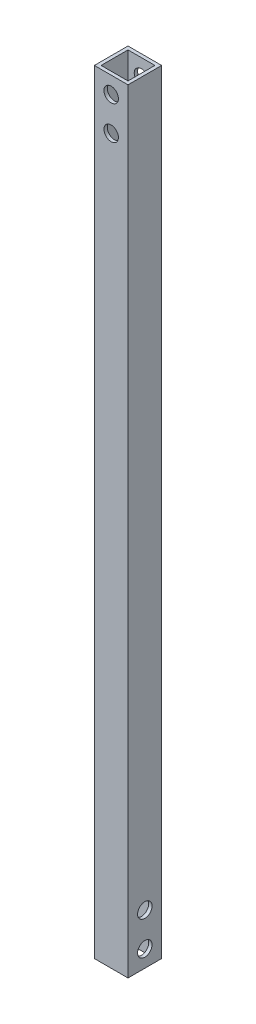
ISO-10303-21;
HEADER;
FILE_DESCRIPTION(('STEP AP214'),'2;1');
FILE_NAME('part.step','',(''),(''),'','','');
FILE_SCHEMA(('AUTOMOTIVE_DESIGN { 1 0 10303 214 1 1 1 1 }'));
ENDSEC;
DATA;
#1=APPLICATION_CONTEXT('core data for automotive mechanical design processes');
#2=APPLICATION_PROTOCOL_DEFINITION('international standard','automotive_design',2000,#1);
#3=PRODUCT_CONTEXT('',#1,'mechanical');
#4=PRODUCT('Part','Part','',(#3));
#5=PRODUCT_RELATED_PRODUCT_CATEGORY('part','',(#4));
#6=PRODUCT_DEFINITION_FORMATION('','',#4);
#7=PRODUCT_DEFINITION_CONTEXT('part definition',#1,'design');
#8=PRODUCT_DEFINITION('design','',#6,#7);
#9=PRODUCT_DEFINITION_SHAPE('','',#8);
#10=(LENGTH_UNIT() NAMED_UNIT(*) SI_UNIT(.MILLI.,.METRE.));
#11=(NAMED_UNIT(*) PLANE_ANGLE_UNIT() SI_UNIT($,.RADIAN.));
#12=(NAMED_UNIT(*) SI_UNIT($,.STERADIAN.) SOLID_ANGLE_UNIT());
#13=UNCERTAINTY_MEASURE_WITH_UNIT(LENGTH_MEASURE(1.E-05),#10,'distance_accuracy_value','');
#14=(GEOMETRIC_REPRESENTATION_CONTEXT(3) GLOBAL_UNCERTAINTY_ASSIGNED_CONTEXT((#13)) GLOBAL_UNIT_ASSIGNED_CONTEXT((#10,
#11,#12)) REPRESENTATION_CONTEXT('',''));
#15=CARTESIAN_POINT('',(0.,0.,0.));
#16=DIRECTION('',(0.,0.,1.));
#17=DIRECTION('',(1.,0.,0.));
#18=AXIS2_PLACEMENT_3D('',#15,#16,#17);
#19=CARTESIAN_POINT('',(0.,230.,0.));
#20=DIRECTION('',(0.,1.,0.));
#21=DIRECTION('',(0.,0.,1.));
#22=AXIS2_PLACEMENT_3D('',#19,#20,#21);
#23=PLANE('',#22);
#24=DIRECTION('',(0.,0.,-1.));
#25=VECTOR('',#24,1.);
#26=CARTESIAN_POINT('',(5.,230.,-5.));
#27=LINE('',#26,#25);
#28=CARTESIAN_POINT('',(5.,230.,5.));
#29=VERTEX_POINT('',#28);
#30=CARTESIAN_POINT('',(5.,230.,-5.));
#31=VERTEX_POINT('',#30);
#32=EDGE_CURVE('E164',#29,#31,#27,.T.);
#33=ORIENTED_EDGE('',*,*,#32,.T.);
#34=DIRECTION('',(-1.,0.,0.));
#35=VECTOR('',#34,1.);
#36=CARTESIAN_POINT('',(-5.,230.,-5.));
#37=LINE('',#36,#35);
#38=CARTESIAN_POINT('',(-5.,230.,-5.));
#39=VERTEX_POINT('',#38);
#40=EDGE_CURVE('E167',#31,#39,#37,.T.);
#41=ORIENTED_EDGE('',*,*,#40,.T.);
#42=DIRECTION('',(0.,0.,1.));
#43=VECTOR('',#42,1.);
#44=CARTESIAN_POINT('',(-5.,230.,-5.));
#45=LINE('',#44,#43);
#46=CARTESIAN_POINT('',(-5.,230.,5.));
#47=VERTEX_POINT('',#46);
#48=EDGE_CURVE('E170',#39,#47,#45,.T.);
#49=ORIENTED_EDGE('',*,*,#48,.T.);
#50=DIRECTION('',(1.,0.,0.));
#51=VECTOR('',#50,1.);
#52=CARTESIAN_POINT('',(-5.,230.,5.));
#53=LINE('',#52,#51);
#54=EDGE_CURVE('E172',#47,#29,#53,.T.);
#55=ORIENTED_EDGE('',*,*,#54,.T.);
#56=EDGE_LOOP('',(#33,#41,#49,#55));
#57=FACE_BOUND('',#56,.T.);
#58=DIRECTION('',(-1.,0.,0.));
#59=VECTOR('',#58,1.);
#60=CARTESIAN_POINT('',(-5.,230.,-4.));
#61=LINE('',#60,#59);
#62=CARTESIAN_POINT('',(4.,230.,-4.));
#63=VERTEX_POINT('',#62);
#64=CARTESIAN_POINT('',(-4.,230.,-4.));
#65=VERTEX_POINT('',#64);
#66=EDGE_CURVE('E134',#63,#65,#61,.T.);
#67=ORIENTED_EDGE('',*,*,#66,.F.);
#68=DIRECTION('',(0.,0.,-1.));
#69=VECTOR('',#68,1.);
#70=CARTESIAN_POINT('',(4.,230.,-5.));
#71=LINE('',#70,#69);
#72=CARTESIAN_POINT('',(4.,230.,4.));
#73=VERTEX_POINT('',#72);
#74=EDGE_CURVE('E126',#73,#63,#71,.T.);
#75=ORIENTED_EDGE('',*,*,#74,.F.);
#76=DIRECTION('',(1.,0.,0.));
#77=VECTOR('',#76,1.);
#78=CARTESIAN_POINT('',(-5.,230.,4.));
#79=LINE('',#78,#77);
#80=CARTESIAN_POINT('',(-4.,230.,4.));
#81=VERTEX_POINT('',#80);
#82=EDGE_CURVE('E148',#81,#73,#79,.T.);
#83=ORIENTED_EDGE('',*,*,#82,.F.);
#84=DIRECTION('',(0.,0.,1.));
#85=VECTOR('',#84,1.);
#86=CARTESIAN_POINT('',(-4.,230.,-5.));
#87=LINE('',#86,#85);
#88=EDGE_CURVE('E146',#65,#81,#87,.T.);
#89=ORIENTED_EDGE('',*,*,#88,.F.);
#90=EDGE_LOOP('',(#67,#75,#83,#89));
#91=FACE_BOUND('',#90,.T.);
#92=ADVANCED_FACE('F59',(#57,#91),#23,.T.);
#93=CARTESIAN_POINT('',(0.,0.,0.));
#94=DIRECTION('',(0.,1.,0.));
#95=DIRECTION('',(0.,0.,1.));
#96=AXIS2_PLACEMENT_3D('',#93,#94,#95);
#97=PLANE('',#96);
#98=DIRECTION('',(0.,0.,-1.));
#99=VECTOR('',#98,1.);
#100=CARTESIAN_POINT('',(5.,0.,-5.));
#101=LINE('',#100,#99);
#102=CARTESIAN_POINT('',(5.,0.,5.));
#103=VERTEX_POINT('',#102);
#104=CARTESIAN_POINT('',(5.,0.,-5.));
#105=VERTEX_POINT('',#104);
#106=EDGE_CURVE('E142',#103,#105,#101,.T.);
#107=ORIENTED_EDGE('',*,*,#106,.F.);
#108=DIRECTION('',(1.,0.,0.));
#109=VECTOR('',#108,1.);
#110=CARTESIAN_POINT('',(-5.,0.,5.));
#111=LINE('',#110,#109);
#112=CARTESIAN_POINT('',(-5.,0.,5.));
#113=VERTEX_POINT('',#112);
#114=EDGE_CURVE('E168',#113,#103,#111,.T.);
#115=ORIENTED_EDGE('',*,*,#114,.F.);
#116=DIRECTION('',(0.,0.,1.));
#117=VECTOR('',#116,1.);
#118=CARTESIAN_POINT('',(-5.,0.,-5.));
#119=LINE('',#118,#117);
#120=CARTESIAN_POINT('',(-5.,0.,-5.));
#121=VERTEX_POINT('',#120);
#122=EDGE_CURVE('E179',#121,#113,#119,.T.);
#123=ORIENTED_EDGE('',*,*,#122,.F.);
#124=DIRECTION('',(-1.,0.,0.));
#125=VECTOR('',#124,1.);
#126=CARTESIAN_POINT('',(-5.,0.,-5.));
#127=LINE('',#126,#125);
#128=EDGE_CURVE('E177',#105,#121,#127,.T.);
#129=ORIENTED_EDGE('',*,*,#128,.F.);
#130=EDGE_LOOP('',(#107,#115,#123,#129));
#131=FACE_BOUND('',#130,.T.);
#132=DIRECTION('',(0.,0.,-1.));
#133=VECTOR('',#132,1.);
#134=CARTESIAN_POINT('',(4.,0.,-5.));
#135=LINE('',#134,#133);
#136=CARTESIAN_POINT('',(4.,0.,4.));
#137=VERTEX_POINT('',#136);
#138=CARTESIAN_POINT('',(4.,0.,-4.));
#139=VERTEX_POINT('',#138);
#140=EDGE_CURVE('E84',#137,#139,#135,.T.);
#141=ORIENTED_EDGE('',*,*,#140,.T.);
#142=DIRECTION('',(-1.,0.,0.));
#143=VECTOR('',#142,1.);
#144=CARTESIAN_POINT('',(-5.,0.,-4.));
#145=LINE('',#144,#143);
#146=CARTESIAN_POINT('',(-4.,0.,-4.));
#147=VERTEX_POINT('',#146);
#148=EDGE_CURVE('E141',#139,#147,#145,.T.);
#149=ORIENTED_EDGE('',*,*,#148,.T.);
#150=DIRECTION('',(0.,0.,1.));
#151=VECTOR('',#150,1.);
#152=CARTESIAN_POINT('',(-4.,0.,-5.));
#153=LINE('',#152,#151);
#154=CARTESIAN_POINT('',(-4.,0.,4.));
#155=VERTEX_POINT('',#154);
#156=EDGE_CURVE('E156',#147,#155,#153,.T.);
#157=ORIENTED_EDGE('',*,*,#156,.T.);
#158=DIRECTION('',(1.,0.,0.));
#159=VECTOR('',#158,1.);
#160=CARTESIAN_POINT('',(-5.,0.,4.));
#161=LINE('',#160,#159);
#162=EDGE_CURVE('E135',#155,#137,#161,.T.);
#163=ORIENTED_EDGE('',*,*,#162,.T.);
#164=EDGE_LOOP('',(#141,#149,#157,#163));
#165=FACE_BOUND('',#164,.T.);
#166=ADVANCED_FACE('F262',(#131,#165),#97,.F.);
#167=CARTESIAN_POINT('',(5.,230.,-5.));
#168=DIRECTION('',(-1.,0.,0.));
#169=DIRECTION('',(0.,0.,1.));
#170=AXIS2_PLACEMENT_3D('',#167,#168,#169);
#171=PLANE('',#170);
#172=CARTESIAN_POINT('',(5.,15.,0.));
#173=DIRECTION('',(1.,0.,0.));
#174=DIRECTION('',(0.,0.,-1.));
#175=AXIS2_PLACEMENT_3D('',#172,#173,#174);
#176=CIRCLE('',#175,2.15);
#177=CARTESIAN_POINT('',(5.,15.,-2.15));
#178=VERTEX_POINT('',#177);
#179=EDGE_CURVE('E205',#178,#178,#176,.T.);
#180=ORIENTED_EDGE('',*,*,#179,.F.);
#181=EDGE_LOOP('',(#180));
#182=FACE_BOUND('',#181,.T.);
#183=CARTESIAN_POINT('',(5.,5.,0.));
#184=DIRECTION('',(1.,0.,0.));
#185=DIRECTION('',(0.,0.,-1.));
#186=AXIS2_PLACEMENT_3D('',#183,#184,#185);
#187=CIRCLE('',#186,2.15);
#188=CARTESIAN_POINT('',(5.,5.,-2.15));
#189=VERTEX_POINT('',#188);
#190=EDGE_CURVE('E215',#189,#189,#187,.T.);
#191=ORIENTED_EDGE('',*,*,#190,.F.);
#192=EDGE_LOOP('',(#191));
#193=FACE_BOUND('',#192,.T.);
#194=ORIENTED_EDGE('',*,*,#106,.T.);
#195=DIRECTION('',(0.,-1.,0.));
#196=VECTOR('',#195,1.);
#197=CARTESIAN_POINT('',(5.,230.,-5.));
#198=LINE('',#197,#196);
#199=EDGE_CURVE('E12',#31,#105,#198,.T.);
#200=ORIENTED_EDGE('',*,*,#199,.F.);
#201=ORIENTED_EDGE('',*,*,#32,.F.);
#202=DIRECTION('',(0.,-1.,0.));
#203=VECTOR('',#202,1.);
#204=CARTESIAN_POINT('',(5.,230.,5.));
#205=LINE('',#204,#203);
#206=EDGE_CURVE('E174',#29,#103,#205,.T.);
#207=ORIENTED_EDGE('',*,*,#206,.T.);
#208=EDGE_LOOP('',(#194,#200,#201,#207));
#209=FACE_BOUND('',#208,.T.);
#210=ADVANCED_FACE('F61',(#182,#193,#209),#171,.F.);
#211=CARTESIAN_POINT('',(-5.,230.,-5.));
#212=DIRECTION('',(0.,0.,1.));
#213=DIRECTION('',(1.,0.,0.));
#214=AXIS2_PLACEMENT_3D('',#211,#212,#213);
#215=PLANE('',#214);
#216=CARTESIAN_POINT('',(0.,215.,-5.));
#217=DIRECTION('',(0.,0.,-1.));
#218=DIRECTION('',(-1.,0.,0.));
#219=AXIS2_PLACEMENT_3D('',#216,#217,#218);
#220=CIRCLE('',#219,2.15000000000002);
#221=CARTESIAN_POINT('',(-2.15000000000002,215.,-5.));
#222=VERTEX_POINT('',#221);
#223=EDGE_CURVE('E193',#222,#222,#220,.T.);
#224=ORIENTED_EDGE('',*,*,#223,.F.);
#225=EDGE_LOOP('',(#224));
#226=FACE_BOUND('',#225,.T.);
#227=CARTESIAN_POINT('',(0.,225.,-5.));
#228=DIRECTION('',(0.,0.,-1.));
#229=DIRECTION('',(-1.,0.,0.));
#230=AXIS2_PLACEMENT_3D('',#227,#228,#229);
#231=CIRCLE('',#230,2.15000000000002);
#232=CARTESIAN_POINT('',(-2.15000000000002,225.,-5.));
#233=VERTEX_POINT('',#232);
#234=EDGE_CURVE('E227',#233,#233,#231,.T.);
#235=ORIENTED_EDGE('',*,*,#234,.F.);
#236=EDGE_LOOP('',(#235));
#237=FACE_BOUND('',#236,.T.);
#238=ORIENTED_EDGE('',*,*,#128,.T.);
#239=DIRECTION('',(0.,-1.,0.));
#240=VECTOR('',#239,1.);
#241=CARTESIAN_POINT('',(-5.,230.,-5.));
#242=LINE('',#241,#240);
#243=EDGE_CURVE('E68',#39,#121,#242,.T.);
#244=ORIENTED_EDGE('',*,*,#243,.F.);
#245=ORIENTED_EDGE('',*,*,#40,.F.);
#246=ORIENTED_EDGE('',*,*,#199,.T.);
#247=EDGE_LOOP('',(#238,#244,#245,#246));
#248=FACE_BOUND('',#247,.T.);
#249=ADVANCED_FACE('F247',(#226,#237,#248),#215,.F.);
#250=CARTESIAN_POINT('',(-5.,230.,-5.));
#251=DIRECTION('',(1.,0.,0.));
#252=DIRECTION('',(0.,0.,-1.));
#253=AXIS2_PLACEMENT_3D('',#250,#251,#252);
#254=PLANE('',#253);
#255=CARTESIAN_POINT('',(-5.,15.,0.));
#256=DIRECTION('',(1.,0.,0.));
#257=DIRECTION('',(0.,0.,-1.));
#258=AXIS2_PLACEMENT_3D('',#255,#256,#257);
#259=CIRCLE('',#258,2.15);
#260=CARTESIAN_POINT('',(-5.,15.,-2.15));
#261=VERTEX_POINT('',#260);
#262=EDGE_CURVE('E199',#261,#261,#259,.T.);
#263=ORIENTED_EDGE('',*,*,#262,.T.);
#264=EDGE_LOOP('',(#263));
#265=FACE_BOUND('',#264,.T.);
#266=CARTESIAN_POINT('',(-5.,5.,0.));
#267=DIRECTION('',(1.,0.,0.));
#268=DIRECTION('',(0.,0.,-1.));
#269=AXIS2_PLACEMENT_3D('',#266,#267,#268);
#270=CIRCLE('',#269,2.15);
#271=CARTESIAN_POINT('',(-5.,5.,-2.15));
#272=VERTEX_POINT('',#271);
#273=EDGE_CURVE('E210',#272,#272,#270,.T.);
#274=ORIENTED_EDGE('',*,*,#273,.T.);
#275=EDGE_LOOP('',(#274));
#276=FACE_BOUND('',#275,.T.);
#277=ORIENTED_EDGE('',*,*,#122,.T.);
#278=DIRECTION('',(0.,-1.,0.));
#279=VECTOR('',#278,1.);
#280=CARTESIAN_POINT('',(-5.,230.,5.));
#281=LINE('',#280,#279);
#282=EDGE_CURVE('E184',#47,#113,#281,.T.);
#283=ORIENTED_EDGE('',*,*,#282,.F.);
#284=ORIENTED_EDGE('',*,*,#48,.F.);
#285=ORIENTED_EDGE('',*,*,#243,.T.);
#286=EDGE_LOOP('',(#277,#283,#284,#285));
#287=FACE_BOUND('',#286,.T.);
#288=ADVANCED_FACE('F250',(#265,#276,#287),#254,.F.);
#289=CARTESIAN_POINT('',(-5.,230.,5.));
#290=DIRECTION('',(0.,0.,-1.));
#291=DIRECTION('',(-1.,0.,0.));
#292=AXIS2_PLACEMENT_3D('',#289,#290,#291);
#293=PLANE('',#292);
#294=CARTESIAN_POINT('',(0.,215.,5.));
#295=DIRECTION('',(0.,0.,-1.));
#296=DIRECTION('',(-1.,0.,0.));
#297=AXIS2_PLACEMENT_3D('',#294,#295,#296);
#298=CIRCLE('',#297,2.15000000000002);
#299=CARTESIAN_POINT('',(-2.15000000000002,215.,5.));
#300=VERTEX_POINT('',#299);
#301=EDGE_CURVE('E224',#300,#300,#298,.T.);
#302=ORIENTED_EDGE('',*,*,#301,.T.);
#303=EDGE_LOOP('',(#302));
#304=FACE_BOUND('',#303,.T.);
#305=CARTESIAN_POINT('',(0.,225.,5.));
#306=DIRECTION('',(0.,0.,-1.));
#307=DIRECTION('',(-1.,0.,0.));
#308=AXIS2_PLACEMENT_3D('',#305,#306,#307);
#309=CIRCLE('',#308,2.15000000000002);
#310=CARTESIAN_POINT('',(-2.15000000000002,225.,5.));
#311=VERTEX_POINT('',#310);
#312=EDGE_CURVE('E221',#311,#311,#309,.T.);
#313=ORIENTED_EDGE('',*,*,#312,.T.);
#314=EDGE_LOOP('',(#313));
#315=FACE_BOUND('',#314,.T.);
#316=ORIENTED_EDGE('',*,*,#114,.T.);
#317=ORIENTED_EDGE('',*,*,#206,.F.);
#318=ORIENTED_EDGE('',*,*,#54,.F.);
#319=ORIENTED_EDGE('',*,*,#282,.T.);
#320=EDGE_LOOP('',(#316,#317,#318,#319));
#321=FACE_BOUND('',#320,.T.);
#322=ADVANCED_FACE('F266',(#304,#315,#321),#293,.F.);
#323=CARTESIAN_POINT('',(4.,230.,-5.));
#324=DIRECTION('',(-1.,0.,0.));
#325=DIRECTION('',(0.,0.,1.));
#326=AXIS2_PLACEMENT_3D('',#323,#324,#325);
#327=PLANE('',#326);
#328=CARTESIAN_POINT('',(4.,15.,0.));
#329=DIRECTION('',(-1.,0.,0.));
#330=DIRECTION('',(0.,0.,1.));
#331=AXIS2_PLACEMENT_3D('',#328,#329,#330);
#332=CIRCLE('',#331,2.15);
#333=CARTESIAN_POINT('',(4.,15.,-2.15));
#334=VERTEX_POINT('',#333);
#335=EDGE_CURVE('E218',#334,#334,#332,.T.);
#336=ORIENTED_EDGE('',*,*,#335,.F.);
#337=EDGE_LOOP('',(#336));
#338=FACE_BOUND('',#337,.T.);
#339=CARTESIAN_POINT('',(4.,5.,0.));
#340=DIRECTION('',(-1.,0.,0.));
#341=DIRECTION('',(0.,0.,1.));
#342=AXIS2_PLACEMENT_3D('',#339,#340,#341);
#343=CIRCLE('',#342,2.15);
#344=CARTESIAN_POINT('',(4.,5.,-2.15));
#345=VERTEX_POINT('',#344);
#346=EDGE_CURVE('E198',#345,#345,#343,.T.);
#347=ORIENTED_EDGE('',*,*,#346,.F.);
#348=EDGE_LOOP('',(#347));
#349=FACE_BOUND('',#348,.T.);
#350=ORIENTED_EDGE('',*,*,#140,.F.);
#351=DIRECTION('',(0.,-1.,0.));
#352=VECTOR('',#351,1.);
#353=CARTESIAN_POINT('',(4.,230.,4.));
#354=LINE('',#353,#352);
#355=EDGE_CURVE('E130',#73,#137,#354,.T.);
#356=ORIENTED_EDGE('',*,*,#355,.F.);
#357=ORIENTED_EDGE('',*,*,#74,.T.);
#358=DIRECTION('',(0.,-1.,0.));
#359=VECTOR('',#358,1.);
#360=CARTESIAN_POINT('',(4.,230.,-4.));
#361=LINE('',#360,#359);
#362=EDGE_CURVE('E129',#63,#139,#361,.T.);
#363=ORIENTED_EDGE('',*,*,#362,.T.);
#364=EDGE_LOOP('',(#350,#356,#357,#363));
#365=FACE_BOUND('',#364,.T.);
#366=ADVANCED_FACE('F128',(#338,#349,#365),#327,.T.);
#367=CARTESIAN_POINT('',(-5.,230.,-4.));
#368=DIRECTION('',(0.,0.,1.));
#369=DIRECTION('',(1.,0.,0.));
#370=AXIS2_PLACEMENT_3D('',#367,#368,#369);
#371=PLANE('',#370);
#372=CARTESIAN_POINT('',(0.,215.,-4.));
#373=DIRECTION('',(0.,0.,1.));
#374=DIRECTION('',(1.,0.,0.));
#375=AXIS2_PLACEMENT_3D('',#372,#373,#374);
#376=CIRCLE('',#375,2.15000000000002);
#377=CARTESIAN_POINT('',(2.15000000000002,215.,-4.));
#378=VERTEX_POINT('',#377);
#379=EDGE_CURVE('E154',#378,#378,#376,.F.);
#380=ORIENTED_EDGE('',*,*,#379,.T.);
#381=EDGE_LOOP('',(#380));
#382=FACE_BOUND('',#381,.T.);
#383=CARTESIAN_POINT('',(0.,225.,-4.));
#384=DIRECTION('',(0.,0.,1.));
#385=DIRECTION('',(1.,0.,0.));
#386=AXIS2_PLACEMENT_3D('',#383,#384,#385);
#387=CIRCLE('',#386,2.15000000000002);
#388=CARTESIAN_POINT('',(2.15000000000002,225.,-4.));
#389=VERTEX_POINT('',#388);
#390=EDGE_CURVE('E192',#389,#389,#387,.F.);
#391=ORIENTED_EDGE('',*,*,#390,.T.);
#392=EDGE_LOOP('',(#391));
#393=FACE_BOUND('',#392,.T.);
#394=ORIENTED_EDGE('',*,*,#148,.F.);
#395=ORIENTED_EDGE('',*,*,#362,.F.);
#396=ORIENTED_EDGE('',*,*,#66,.T.);
#397=DIRECTION('',(0.,-1.,0.));
#398=VECTOR('',#397,1.);
#399=CARTESIAN_POINT('',(-4.,230.,-4.));
#400=LINE('',#399,#398);
#401=EDGE_CURVE('E143',#65,#147,#400,.T.);
#402=ORIENTED_EDGE('',*,*,#401,.T.);
#403=EDGE_LOOP('',(#394,#395,#396,#402));
#404=FACE_BOUND('',#403,.T.);
#405=ADVANCED_FACE('F138',(#382,#393,#404),#371,.T.);
#406=CARTESIAN_POINT('',(-4.,230.,-5.));
#407=DIRECTION('',(1.,0.,0.));
#408=DIRECTION('',(0.,0.,-1.));
#409=AXIS2_PLACEMENT_3D('',#406,#407,#408);
#410=PLANE('',#409);
#411=CARTESIAN_POINT('',(-4.,15.,0.));
#412=DIRECTION('',(1.,0.,0.));
#413=DIRECTION('',(0.,0.,-1.));
#414=AXIS2_PLACEMENT_3D('',#411,#412,#413);
#415=CIRCLE('',#414,2.15);
#416=CARTESIAN_POINT('',(-4.,15.,-2.15));
#417=VERTEX_POINT('',#416);
#418=EDGE_CURVE('E63',#417,#417,#415,.T.);
#419=ORIENTED_EDGE('',*,*,#418,.F.);
#420=EDGE_LOOP('',(#419));
#421=FACE_BOUND('',#420,.T.);
#422=CARTESIAN_POINT('',(-4.,5.,0.));
#423=DIRECTION('',(1.,0.,0.));
#424=DIRECTION('',(0.,0.,-1.));
#425=AXIS2_PLACEMENT_3D('',#422,#423,#424);
#426=CIRCLE('',#425,2.15);
#427=CARTESIAN_POINT('',(-4.,5.,-2.15));
#428=VERTEX_POINT('',#427);
#429=EDGE_CURVE('E196',#428,#428,#426,.T.);
#430=ORIENTED_EDGE('',*,*,#429,.F.);
#431=EDGE_LOOP('',(#430));
#432=FACE_BOUND('',#431,.T.);
#433=ORIENTED_EDGE('',*,*,#156,.F.);
#434=ORIENTED_EDGE('',*,*,#401,.F.);
#435=ORIENTED_EDGE('',*,*,#88,.T.);
#436=DIRECTION('',(0.,-1.,0.));
#437=VECTOR('',#436,1.);
#438=CARTESIAN_POINT('',(-4.,230.,4.));
#439=LINE('',#438,#437);
#440=EDGE_CURVE('E76',#81,#155,#439,.T.);
#441=ORIENTED_EDGE('',*,*,#440,.T.);
#442=EDGE_LOOP('',(#433,#434,#435,#441));
#443=FACE_BOUND('',#442,.T.);
#444=ADVANCED_FACE('F342',(#421,#432,#443),#410,.T.);
#445=CARTESIAN_POINT('',(-5.,230.,4.));
#446=DIRECTION('',(0.,0.,-1.));
#447=DIRECTION('',(-1.,0.,0.));
#448=AXIS2_PLACEMENT_3D('',#445,#446,#447);
#449=PLANE('',#448);
#450=CARTESIAN_POINT('',(0.,215.,4.));
#451=DIRECTION('',(0.,0.,-1.));
#452=DIRECTION('',(-1.,0.,0.));
#453=AXIS2_PLACEMENT_3D('',#450,#451,#452);
#454=CIRCLE('',#453,2.15000000000002);
#455=CARTESIAN_POINT('',(-2.15000000000002,215.,4.));
#456=VERTEX_POINT('',#455);
#457=EDGE_CURVE('E194',#456,#456,#454,.F.);
#458=ORIENTED_EDGE('',*,*,#457,.T.);
#459=EDGE_LOOP('',(#458));
#460=FACE_BOUND('',#459,.T.);
#461=CARTESIAN_POINT('',(0.,225.,4.));
#462=DIRECTION('',(0.,0.,-1.));
#463=DIRECTION('',(-1.,0.,0.));
#464=AXIS2_PLACEMENT_3D('',#461,#462,#463);
#465=CIRCLE('',#464,2.15000000000002);
#466=CARTESIAN_POINT('',(-2.15000000000002,225.,4.));
#467=VERTEX_POINT('',#466);
#468=EDGE_CURVE('E189',#467,#467,#465,.F.);
#469=ORIENTED_EDGE('',*,*,#468,.T.);
#470=EDGE_LOOP('',(#469));
#471=FACE_BOUND('',#470,.T.);
#472=ORIENTED_EDGE('',*,*,#162,.F.);
#473=ORIENTED_EDGE('',*,*,#440,.F.);
#474=ORIENTED_EDGE('',*,*,#82,.T.);
#475=ORIENTED_EDGE('',*,*,#355,.T.);
#476=EDGE_LOOP('',(#472,#473,#474,#475));
#477=FACE_BOUND('',#476,.T.);
#478=ADVANCED_FACE('F348',(#460,#471,#477),#449,.T.);
#479=CARTESIAN_POINT('',(0.,225.,-5.));
#480=DIRECTION('',(0.,0.,1.));
#481=DIRECTION('',(1.,0.,0.));
#482=AXIS2_PLACEMENT_3D('',#479,#480,#481);
#483=CYLINDRICAL_SURFACE('',#482,2.15000000000002);
#484=ORIENTED_EDGE('',*,*,#468,.F.);
#485=EDGE_LOOP('',(#484));
#486=FACE_BOUND('',#485,.T.);
#487=ORIENTED_EDGE('',*,*,#312,.F.);
#488=EDGE_LOOP('',(#487));
#489=FACE_BOUND('',#488,.T.);
#490=ADVANCED_FACE('F353',(#486,#489),#483,.F.);
#491=CARTESIAN_POINT('',(0.,215.,-5.));
#492=DIRECTION('',(0.,0.,1.));
#493=DIRECTION('',(1.,0.,0.));
#494=AXIS2_PLACEMENT_3D('',#491,#492,#493);
#495=CYLINDRICAL_SURFACE('',#494,2.15000000000002);
#496=ORIENTED_EDGE('',*,*,#457,.F.);
#497=EDGE_LOOP('',(#496));
#498=FACE_BOUND('',#497,.T.);
#499=ORIENTED_EDGE('',*,*,#301,.F.);
#500=EDGE_LOOP('',(#499));
#501=FACE_BOUND('',#500,.T.);
#502=ADVANCED_FACE('F244',(#498,#501),#495,.F.);
#503=ORIENTED_EDGE('',*,*,#390,.F.);
#504=EDGE_LOOP('',(#503));
#505=FACE_BOUND('',#504,.T.);
#506=ORIENTED_EDGE('',*,*,#234,.T.);
#507=EDGE_LOOP('',(#506));
#508=FACE_BOUND('',#507,.T.);
#509=ADVANCED_FACE('F242',(#505,#508),#483,.F.);
#510=ORIENTED_EDGE('',*,*,#379,.F.);
#511=EDGE_LOOP('',(#510));
#512=FACE_BOUND('',#511,.T.);
#513=ORIENTED_EDGE('',*,*,#223,.T.);
#514=EDGE_LOOP('',(#513));
#515=FACE_BOUND('',#514,.T.);
#516=ADVANCED_FACE('F238',(#512,#515),#495,.F.);
#517=CARTESIAN_POINT('',(-5.,5.,0.));
#518=DIRECTION('',(1.,0.,0.));
#519=DIRECTION('',(0.,0.,-1.));
#520=AXIS2_PLACEMENT_3D('',#517,#518,#519);
#521=CYLINDRICAL_SURFACE('',#520,2.15);
#522=CARTESIAN_POINT('',(-4.,5.,-2.15));
#523=CARTESIAN_POINT('',(-4.01041666666667,5.,-2.15));
#524=CARTESIAN_POINT('',(-4.02083333333333,5.,-2.15));
#525=CARTESIAN_POINT('',(-4.04166666666667,5.,-2.15));
#526=CARTESIAN_POINT('',(-4.05208333333333,5.,-2.15));
#527=CARTESIAN_POINT('',(-4.07291666666667,5.,-2.15));
#528=CARTESIAN_POINT('',(-4.08333333333333,5.,-2.15));
#529=CARTESIAN_POINT('',(-4.10416666666667,5.,-2.15));
#530=CARTESIAN_POINT('',(-4.11458333333333,5.,-2.15));
#531=CARTESIAN_POINT('',(-4.13541666666667,5.,-2.15));
#532=CARTESIAN_POINT('',(-4.14583333333333,5.,-2.15));
#533=CARTESIAN_POINT('',(-4.16666666666667,5.,-2.15));
#534=CARTESIAN_POINT('',(-4.17708333333333,5.,-2.15));
#535=CARTESIAN_POINT('',(-4.19791666666667,5.,-2.15));
#536=CARTESIAN_POINT('',(-4.20833333333333,5.,-2.15));
#537=CARTESIAN_POINT('',(-4.22916666666667,5.,-2.15));
#538=CARTESIAN_POINT('',(-4.23958333333333,5.,-2.15));
#539=CARTESIAN_POINT('',(-4.26041666666667,5.,-2.15));
#540=CARTESIAN_POINT('',(-4.27083333333333,5.,-2.15));
#541=CARTESIAN_POINT('',(-4.29166666666667,5.,-2.15));
#542=CARTESIAN_POINT('',(-4.30208333333334,5.,-2.15));
#543=CARTESIAN_POINT('',(-4.32291666666667,5.,-2.15));
#544=CARTESIAN_POINT('',(-4.33333333333334,5.,-2.15));
#545=CARTESIAN_POINT('',(-4.35416666666667,5.,-2.15));
#546=CARTESIAN_POINT('',(-4.36458333333334,5.,-2.15));
#547=CARTESIAN_POINT('',(-4.38541666666667,5.,-2.15));
#548=CARTESIAN_POINT('',(-4.39583333333334,5.,-2.15));
#549=CARTESIAN_POINT('',(-4.41666666666667,5.,-2.15));
#550=CARTESIAN_POINT('',(-4.42708333333334,5.,-2.15));
#551=CARTESIAN_POINT('',(-4.44791666666667,5.,-2.15));
#552=CARTESIAN_POINT('',(-4.45833333333334,5.,-2.15));
#553=CARTESIAN_POINT('',(-4.47916666666667,5.,-2.15));
#554=CARTESIAN_POINT('',(-4.48958333333334,5.,-2.15));
#555=CARTESIAN_POINT('',(-4.51041666666667,5.,-2.15));
#556=CARTESIAN_POINT('',(-4.52083333333334,5.,-2.15));
#557=CARTESIAN_POINT('',(-4.54166666666667,5.,-2.15));
#558=CARTESIAN_POINT('',(-4.55208333333334,5.,-2.15));
#559=CARTESIAN_POINT('',(-4.57291666666667,5.,-2.15));
#560=CARTESIAN_POINT('',(-4.58333333333334,5.,-2.15));
#561=CARTESIAN_POINT('',(-4.60416666666667,5.,-2.15));
#562=CARTESIAN_POINT('',(-4.61458333333334,5.,-2.15));
#563=CARTESIAN_POINT('',(-4.63541666666667,5.,-2.15));
#564=CARTESIAN_POINT('',(-4.64583333333334,5.,-2.15));
#565=CARTESIAN_POINT('',(-4.66666666666667,5.,-2.15));
#566=CARTESIAN_POINT('',(-4.67708333333334,5.,-2.15));
#567=CARTESIAN_POINT('',(-4.69791666666667,5.,-2.15));
#568=CARTESIAN_POINT('',(-4.70833333333334,5.,-2.15));
#569=CARTESIAN_POINT('',(-4.72916666666667,5.,-2.15));
#570=CARTESIAN_POINT('',(-4.73958333333334,5.,-2.15));
#571=CARTESIAN_POINT('',(-4.76041666666667,5.,-2.15));
#572=CARTESIAN_POINT('',(-4.77083333333334,5.,-2.15));
#573=CARTESIAN_POINT('',(-4.79166666666667,5.,-2.15));
#574=CARTESIAN_POINT('',(-4.80208333333334,5.,-2.15));
#575=CARTESIAN_POINT('',(-4.82291666666667,5.,-2.15));
#576=CARTESIAN_POINT('',(-4.83333333333334,5.,-2.15));
#577=CARTESIAN_POINT('',(-4.85416666666667,5.,-2.15));
#578=CARTESIAN_POINT('',(-4.86458333333334,5.,-2.15));
#579=CARTESIAN_POINT('',(-4.88541666666667,5.,-2.15));
#580=CARTESIAN_POINT('',(-4.89583333333334,5.,-2.15));
#581=CARTESIAN_POINT('',(-4.91666666666667,5.,-2.15));
#582=CARTESIAN_POINT('',(-4.92708333333334,5.,-2.15));
#583=CARTESIAN_POINT('',(-4.94791666666667,5.,-2.15));
#584=CARTESIAN_POINT('',(-4.95833333333334,5.,-2.15));
#585=CARTESIAN_POINT('',(-4.97916666666667,5.,-2.15));
#586=CARTESIAN_POINT('',(-4.98958333333334,5.,-2.15));
#587=CARTESIAN_POINT('',(-5.,5.,-2.15));
#588=B_SPLINE_CURVE_WITH_KNOTS('',3,(#522,#523,#524,#525,#526,#527,#528,#529,#530,#531,#532,
#533,#534,#535,#536,#537,#538,#539,#540,#541,#542,#543,#544,#545,#546,#547,#548,#549,#550,#551,
#552,#553,#554,#555,#556,#557,#558,#559,#560,#561,#562,#563,#564,#565,#566,#567,#568,#569,#570,
#571,#572,#573,#574,#575,#576,#577,#578,#579,#580,#581,#582,#583,#584,#585,#586,#587),
.UNSPECIFIED.,.F.,.F.,(4,2,2,2,2,2,2,2,2,2,2,2,2,2,2,2,2,2,2,2,2,2,2,2,2,2,2,2,2,2,2,2,4),(0.,
0.03125,0.0625000000000001,0.0937500000000001,0.125,0.15625,0.1875,0.21875,0.25,
0.281250000000001,0.312500000000001,0.343750000000001,0.375000000000001,0.406250000000001,
0.437500000000001,0.468750000000001,0.500000000000001,0.531250000000001,0.562500000000001,
0.593750000000001,0.625000000000001,0.656250000000002,0.687500000000002,0.718750000000002,
0.750000000000002,0.781250000000002,0.812500000000002,0.843750000000002,0.875000000000003,
0.906250000000003,0.937500000000003,0.968750000000003,1.),.UNSPECIFIED.);
#589=EDGE_CURVE('BSEAM241',#428,#272,#588,.T.);
#590=ORIENTED_EDGE('',*,*,#429,.T.);
#591=ORIENTED_EDGE('',*,*,#273,.F.);
#592=ORIENTED_EDGE('',*,*,#589,.T.);
#593=ORIENTED_EDGE('',*,*,#589,.F.);
#594=EDGE_LOOP('',(#590,#592,#591,#593));
#595=FACE_BOUND('',#594,.T.);
#596=ADVANCED_FACE('F241',(#595),#521,.F.);
#597=CARTESIAN_POINT('',(-5.,15.,0.));
#598=DIRECTION('',(1.,0.,0.));
#599=DIRECTION('',(0.,0.,-1.));
#600=AXIS2_PLACEMENT_3D('',#597,#598,#599);
#601=CYLINDRICAL_SURFACE('',#600,2.15);
#602=CARTESIAN_POINT('',(-4.,15.,-2.15));
#603=CARTESIAN_POINT('',(-4.01041666666667,15.,-2.15));
#604=CARTESIAN_POINT('',(-4.02083333333333,15.,-2.15));
#605=CARTESIAN_POINT('',(-4.04166666666667,15.,-2.15));
#606=CARTESIAN_POINT('',(-4.05208333333333,15.,-2.15));
#607=CARTESIAN_POINT('',(-4.07291666666667,15.,-2.15));
#608=CARTESIAN_POINT('',(-4.08333333333333,15.,-2.15));
#609=CARTESIAN_POINT('',(-4.10416666666667,15.,-2.15));
#610=CARTESIAN_POINT('',(-4.11458333333333,15.,-2.15));
#611=CARTESIAN_POINT('',(-4.13541666666667,15.,-2.15));
#612=CARTESIAN_POINT('',(-4.14583333333333,15.,-2.15));
#613=CARTESIAN_POINT('',(-4.16666666666667,15.,-2.15));
#614=CARTESIAN_POINT('',(-4.17708333333333,15.,-2.15));
#615=CARTESIAN_POINT('',(-4.19791666666667,15.,-2.15));
#616=CARTESIAN_POINT('',(-4.20833333333333,15.,-2.15));
#617=CARTESIAN_POINT('',(-4.22916666666667,15.,-2.15));
#618=CARTESIAN_POINT('',(-4.23958333333333,15.,-2.15));
#619=CARTESIAN_POINT('',(-4.26041666666667,15.,-2.15));
#620=CARTESIAN_POINT('',(-4.27083333333333,15.,-2.15));
#621=CARTESIAN_POINT('',(-4.29166666666667,15.,-2.15));
#622=CARTESIAN_POINT('',(-4.30208333333334,15.,-2.15));
#623=CARTESIAN_POINT('',(-4.32291666666667,15.,-2.15));
#624=CARTESIAN_POINT('',(-4.33333333333334,15.,-2.15));
#625=CARTESIAN_POINT('',(-4.35416666666667,15.,-2.15));
#626=CARTESIAN_POINT('',(-4.36458333333334,15.,-2.15));
#627=CARTESIAN_POINT('',(-4.38541666666667,15.,-2.15));
#628=CARTESIAN_POINT('',(-4.39583333333334,15.,-2.15));
#629=CARTESIAN_POINT('',(-4.41666666666667,15.,-2.15));
#630=CARTESIAN_POINT('',(-4.42708333333334,15.,-2.15));
#631=CARTESIAN_POINT('',(-4.44791666666667,15.,-2.15));
#632=CARTESIAN_POINT('',(-4.45833333333334,15.,-2.15));
#633=CARTESIAN_POINT('',(-4.47916666666667,15.,-2.15));
#634=CARTESIAN_POINT('',(-4.48958333333334,15.,-2.15));
#635=CARTESIAN_POINT('',(-4.51041666666667,15.,-2.15));
#636=CARTESIAN_POINT('',(-4.52083333333334,15.,-2.15));
#637=CARTESIAN_POINT('',(-4.54166666666667,15.,-2.15));
#638=CARTESIAN_POINT('',(-4.55208333333334,15.,-2.15));
#639=CARTESIAN_POINT('',(-4.57291666666667,15.,-2.15));
#640=CARTESIAN_POINT('',(-4.58333333333334,15.,-2.15));
#641=CARTESIAN_POINT('',(-4.60416666666667,15.,-2.15));
#642=CARTESIAN_POINT('',(-4.61458333333334,15.,-2.15));
#643=CARTESIAN_POINT('',(-4.63541666666667,15.,-2.15));
#644=CARTESIAN_POINT('',(-4.64583333333334,15.,-2.15));
#645=CARTESIAN_POINT('',(-4.66666666666667,15.,-2.15));
#646=CARTESIAN_POINT('',(-4.67708333333334,15.,-2.15));
#647=CARTESIAN_POINT('',(-4.69791666666667,15.,-2.15));
#648=CARTESIAN_POINT('',(-4.70833333333334,15.,-2.15));
#649=CARTESIAN_POINT('',(-4.72916666666667,15.,-2.15));
#650=CARTESIAN_POINT('',(-4.73958333333334,15.,-2.15));
#651=CARTESIAN_POINT('',(-4.76041666666667,15.,-2.15));
#652=CARTESIAN_POINT('',(-4.77083333333334,15.,-2.15));
#653=CARTESIAN_POINT('',(-4.79166666666667,15.,-2.15));
#654=CARTESIAN_POINT('',(-4.80208333333334,15.,-2.15));
#655=CARTESIAN_POINT('',(-4.82291666666667,15.,-2.15));
#656=CARTESIAN_POINT('',(-4.83333333333334,15.,-2.15));
#657=CARTESIAN_POINT('',(-4.85416666666667,15.,-2.15));
#658=CARTESIAN_POINT('',(-4.86458333333334,15.,-2.15));
#659=CARTESIAN_POINT('',(-4.88541666666667,15.,-2.15));
#660=CARTESIAN_POINT('',(-4.89583333333334,15.,-2.15));
#661=CARTESIAN_POINT('',(-4.91666666666667,15.,-2.15));
#662=CARTESIAN_POINT('',(-4.92708333333334,15.,-2.15));
#663=CARTESIAN_POINT('',(-4.94791666666667,15.,-2.15));
#664=CARTESIAN_POINT('',(-4.95833333333334,15.,-2.15));
#665=CARTESIAN_POINT('',(-4.97916666666667,15.,-2.15));
#666=CARTESIAN_POINT('',(-4.98958333333334,15.,-2.15));
#667=CARTESIAN_POINT('',(-5.,15.,-2.15));
#668=B_SPLINE_CURVE_WITH_KNOTS('',3,(#602,#603,#604,#605,#606,#607,#608,#609,#610,#611,#612,
#613,#614,#615,#616,#617,#618,#619,#620,#621,#622,#623,#624,#625,#626,#627,#628,#629,#630,#631,
#632,#633,#634,#635,#636,#637,#638,#639,#640,#641,#642,#643,#644,#645,#646,#647,#648,#649,#650,
#651,#652,#653,#654,#655,#656,#657,#658,#659,#660,#661,#662,#663,#664,#665,#666,#667),
.UNSPECIFIED.,.F.,.F.,(4,2,2,2,2,2,2,2,2,2,2,2,2,2,2,2,2,2,2,2,2,2,2,2,2,2,2,2,2,2,2,2,4),(0.,
0.03125,0.0625000000000001,0.0937500000000001,0.125,0.15625,0.1875,0.21875,0.25,
0.281250000000001,0.312500000000001,0.343750000000001,0.375000000000001,0.406250000000001,
0.437500000000001,0.468750000000001,0.500000000000001,0.531250000000001,0.562500000000001,
0.593750000000001,0.625000000000001,0.656250000000002,0.687500000000002,0.718750000000002,
0.750000000000002,0.781250000000002,0.812500000000002,0.843750000000002,0.875000000000003,
0.906250000000003,0.937500000000003,0.968750000000003,1.),.UNSPECIFIED.);
#669=EDGE_CURVE('BSEAM290',#417,#261,#668,.T.);
#670=ORIENTED_EDGE('',*,*,#418,.T.);
#671=ORIENTED_EDGE('',*,*,#262,.F.);
#672=ORIENTED_EDGE('',*,*,#669,.T.);
#673=ORIENTED_EDGE('',*,*,#669,.F.);
#674=EDGE_LOOP('',(#670,#672,#671,#673));
#675=FACE_BOUND('',#674,.T.);
#676=ADVANCED_FACE('F290',(#675),#601,.F.);
#677=CARTESIAN_POINT('',(4.,5.,-2.15));
#678=CARTESIAN_POINT('',(4.01041666666667,5.,-2.15));
#679=CARTESIAN_POINT('',(4.02083333333333,5.,-2.15));
#680=CARTESIAN_POINT('',(4.04166666666667,5.,-2.15));
#681=CARTESIAN_POINT('',(4.05208333333333,5.,-2.15));
#682=CARTESIAN_POINT('',(4.07291666666667,5.,-2.15));
#683=CARTESIAN_POINT('',(4.08333333333333,5.,-2.15));
#684=CARTESIAN_POINT('',(4.10416666666667,5.,-2.15));
#685=CARTESIAN_POINT('',(4.11458333333333,5.,-2.15));
#686=CARTESIAN_POINT('',(4.13541666666667,5.,-2.15));
#687=CARTESIAN_POINT('',(4.14583333333333,5.,-2.15));
#688=CARTESIAN_POINT('',(4.16666666666667,5.,-2.15));
#689=CARTESIAN_POINT('',(4.17708333333333,5.,-2.15));
#690=CARTESIAN_POINT('',(4.19791666666667,5.,-2.15));
#691=CARTESIAN_POINT('',(4.20833333333333,5.,-2.15));
#692=CARTESIAN_POINT('',(4.22916666666667,5.,-2.15));
#693=CARTESIAN_POINT('',(4.23958333333333,5.,-2.15));
#694=CARTESIAN_POINT('',(4.26041666666667,5.,-2.15));
#695=CARTESIAN_POINT('',(4.27083333333333,5.,-2.15));
#696=CARTESIAN_POINT('',(4.29166666666667,5.,-2.15));
#697=CARTESIAN_POINT('',(4.30208333333333,5.,-2.15));
#698=CARTESIAN_POINT('',(4.32291666666667,5.,-2.15));
#699=CARTESIAN_POINT('',(4.33333333333333,5.,-2.15));
#700=CARTESIAN_POINT('',(4.35416666666667,5.,-2.15));
#701=CARTESIAN_POINT('',(4.36458333333333,5.,-2.15));
#702=CARTESIAN_POINT('',(4.38541666666667,5.,-2.15));
#703=CARTESIAN_POINT('',(4.39583333333333,5.,-2.15));
#704=CARTESIAN_POINT('',(4.41666666666667,5.,-2.15));
#705=CARTESIAN_POINT('',(4.42708333333333,5.,-2.15));
#706=CARTESIAN_POINT('',(4.44791666666667,5.,-2.15));
#707=CARTESIAN_POINT('',(4.45833333333333,5.,-2.15));
#708=CARTESIAN_POINT('',(4.47916666666667,5.,-2.15));
#709=CARTESIAN_POINT('',(4.48958333333333,5.,-2.15));
#710=CARTESIAN_POINT('',(4.51041666666667,5.,-2.15));
#711=CARTESIAN_POINT('',(4.52083333333333,5.,-2.15));
#712=CARTESIAN_POINT('',(4.54166666666667,5.,-2.15));
#713=CARTESIAN_POINT('',(4.55208333333333,5.,-2.15));
#714=CARTESIAN_POINT('',(4.57291666666667,5.,-2.15));
#715=CARTESIAN_POINT('',(4.58333333333333,5.,-2.15));
#716=CARTESIAN_POINT('',(4.60416666666667,5.,-2.15));
#717=CARTESIAN_POINT('',(4.61458333333333,5.,-2.15));
#718=CARTESIAN_POINT('',(4.63541666666667,5.,-2.15));
#719=CARTESIAN_POINT('',(4.64583333333333,5.,-2.15));
#720=CARTESIAN_POINT('',(4.66666666666667,5.,-2.15));
#721=CARTESIAN_POINT('',(4.67708333333333,5.,-2.15));
#722=CARTESIAN_POINT('',(4.69791666666667,5.,-2.15));
#723=CARTESIAN_POINT('',(4.70833333333333,5.,-2.15));
#724=CARTESIAN_POINT('',(4.72916666666667,5.,-2.15));
#725=CARTESIAN_POINT('',(4.73958333333333,5.,-2.15));
#726=CARTESIAN_POINT('',(4.76041666666667,5.,-2.15));
#727=CARTESIAN_POINT('',(4.77083333333333,5.,-2.15));
#728=CARTESIAN_POINT('',(4.79166666666667,5.,-2.15));
#729=CARTESIAN_POINT('',(4.80208333333333,5.,-2.15));
#730=CARTESIAN_POINT('',(4.82291666666667,5.,-2.15));
#731=CARTESIAN_POINT('',(4.83333333333333,5.,-2.15));
#732=CARTESIAN_POINT('',(4.85416666666667,5.,-2.15));
#733=CARTESIAN_POINT('',(4.86458333333333,5.,-2.15));
#734=CARTESIAN_POINT('',(4.88541666666667,5.,-2.15));
#735=CARTESIAN_POINT('',(4.89583333333333,5.,-2.15));
#736=CARTESIAN_POINT('',(4.91666666666667,5.,-2.15));
#737=CARTESIAN_POINT('',(4.92708333333333,5.,-2.15));
#738=CARTESIAN_POINT('',(4.94791666666667,5.,-2.15));
#739=CARTESIAN_POINT('',(4.95833333333333,5.,-2.15));
#740=CARTESIAN_POINT('',(4.97916666666667,5.,-2.15));
#741=CARTESIAN_POINT('',(4.98958333333333,5.,-2.15));
#742=CARTESIAN_POINT('',(5.,5.,-2.15));
#743=B_SPLINE_CURVE_WITH_KNOTS('',3,(#677,#678,#679,#680,#681,#682,#683,#684,#685,#686,#687,
#688,#689,#690,#691,#692,#693,#694,#695,#696,#697,#698,#699,#700,#701,#702,#703,#704,#705,#706,
#707,#708,#709,#710,#711,#712,#713,#714,#715,#716,#717,#718,#719,#720,#721,#722,#723,#724,#725,
#726,#727,#728,#729,#730,#731,#732,#733,#734,#735,#736,#737,#738,#739,#740,#741,#742),
.UNSPECIFIED.,.F.,.F.,(4,2,2,2,2,2,2,2,2,2,2,2,2,2,2,2,2,2,2,2,2,2,2,2,2,2,2,2,2,2,2,2,4),(0.,
0.03125,0.0625000000000001,0.0937500000000001,0.125,0.15625,0.1875,0.21875,0.25,0.28125,0.3125,
0.34375,0.375,0.40625,0.4375,0.46875,0.5,0.53125,0.5625,0.593750000000001,0.625000000000001,
0.656250000000001,0.687500000000001,0.718750000000001,0.750000000000001,0.781250000000001,
0.812500000000001,0.843750000000001,0.875000000000001,0.906250000000001,0.937500000000001,
0.968750000000001,1.),.UNSPECIFIED.);
#744=EDGE_CURVE('BSEAM292',#345,#189,#743,.T.);
#745=ORIENTED_EDGE('',*,*,#346,.T.);
#746=ORIENTED_EDGE('',*,*,#190,.T.);
#747=ORIENTED_EDGE('',*,*,#744,.T.);
#748=ORIENTED_EDGE('',*,*,#744,.F.);
#749=EDGE_LOOP('',(#745,#747,#746,#748));
#750=FACE_BOUND('',#749,.T.);
#751=ADVANCED_FACE('F292',(#750),#521,.F.);
#752=CARTESIAN_POINT('',(4.,15.,-2.15));
#753=CARTESIAN_POINT('',(4.01041666666667,15.,-2.15));
#754=CARTESIAN_POINT('',(4.02083333333333,15.,-2.15));
#755=CARTESIAN_POINT('',(4.04166666666667,15.,-2.15));
#756=CARTESIAN_POINT('',(4.05208333333333,15.,-2.15));
#757=CARTESIAN_POINT('',(4.07291666666667,15.,-2.15));
#758=CARTESIAN_POINT('',(4.08333333333333,15.,-2.15));
#759=CARTESIAN_POINT('',(4.10416666666667,15.,-2.15));
#760=CARTESIAN_POINT('',(4.11458333333333,15.,-2.15));
#761=CARTESIAN_POINT('',(4.13541666666667,15.,-2.15));
#762=CARTESIAN_POINT('',(4.14583333333333,15.,-2.15));
#763=CARTESIAN_POINT('',(4.16666666666667,15.,-2.15));
#764=CARTESIAN_POINT('',(4.17708333333333,15.,-2.15));
#765=CARTESIAN_POINT('',(4.19791666666667,15.,-2.15));
#766=CARTESIAN_POINT('',(4.20833333333333,15.,-2.15));
#767=CARTESIAN_POINT('',(4.22916666666667,15.,-2.15));
#768=CARTESIAN_POINT('',(4.23958333333333,15.,-2.15));
#769=CARTESIAN_POINT('',(4.26041666666667,15.,-2.15));
#770=CARTESIAN_POINT('',(4.27083333333333,15.,-2.15));
#771=CARTESIAN_POINT('',(4.29166666666667,15.,-2.15));
#772=CARTESIAN_POINT('',(4.30208333333333,15.,-2.15));
#773=CARTESIAN_POINT('',(4.32291666666667,15.,-2.15));
#774=CARTESIAN_POINT('',(4.33333333333333,15.,-2.15));
#775=CARTESIAN_POINT('',(4.35416666666667,15.,-2.15));
#776=CARTESIAN_POINT('',(4.36458333333333,15.,-2.15));
#777=CARTESIAN_POINT('',(4.38541666666667,15.,-2.15));
#778=CARTESIAN_POINT('',(4.39583333333333,15.,-2.15));
#779=CARTESIAN_POINT('',(4.41666666666667,15.,-2.15));
#780=CARTESIAN_POINT('',(4.42708333333333,15.,-2.15));
#781=CARTESIAN_POINT('',(4.44791666666667,15.,-2.15));
#782=CARTESIAN_POINT('',(4.45833333333333,15.,-2.15));
#783=CARTESIAN_POINT('',(4.47916666666667,15.,-2.15));
#784=CARTESIAN_POINT('',(4.48958333333333,15.,-2.15));
#785=CARTESIAN_POINT('',(4.51041666666667,15.,-2.15));
#786=CARTESIAN_POINT('',(4.52083333333333,15.,-2.15));
#787=CARTESIAN_POINT('',(4.54166666666667,15.,-2.15));
#788=CARTESIAN_POINT('',(4.55208333333333,15.,-2.15));
#789=CARTESIAN_POINT('',(4.57291666666667,15.,-2.15));
#790=CARTESIAN_POINT('',(4.58333333333333,15.,-2.15));
#791=CARTESIAN_POINT('',(4.60416666666667,15.,-2.15));
#792=CARTESIAN_POINT('',(4.61458333333333,15.,-2.15));
#793=CARTESIAN_POINT('',(4.63541666666667,15.,-2.15));
#794=CARTESIAN_POINT('',(4.64583333333333,15.,-2.15));
#795=CARTESIAN_POINT('',(4.66666666666667,15.,-2.15));
#796=CARTESIAN_POINT('',(4.67708333333333,15.,-2.15));
#797=CARTESIAN_POINT('',(4.69791666666667,15.,-2.15));
#798=CARTESIAN_POINT('',(4.70833333333333,15.,-2.15));
#799=CARTESIAN_POINT('',(4.72916666666667,15.,-2.15));
#800=CARTESIAN_POINT('',(4.73958333333333,15.,-2.15));
#801=CARTESIAN_POINT('',(4.76041666666667,15.,-2.15));
#802=CARTESIAN_POINT('',(4.77083333333333,15.,-2.15));
#803=CARTESIAN_POINT('',(4.79166666666667,15.,-2.15));
#804=CARTESIAN_POINT('',(4.80208333333333,15.,-2.15));
#805=CARTESIAN_POINT('',(4.82291666666667,15.,-2.15));
#806=CARTESIAN_POINT('',(4.83333333333333,15.,-2.15));
#807=CARTESIAN_POINT('',(4.85416666666667,15.,-2.15));
#808=CARTESIAN_POINT('',(4.86458333333333,15.,-2.15));
#809=CARTESIAN_POINT('',(4.88541666666667,15.,-2.15));
#810=CARTESIAN_POINT('',(4.89583333333333,15.,-2.15));
#811=CARTESIAN_POINT('',(4.91666666666667,15.,-2.15));
#812=CARTESIAN_POINT('',(4.92708333333333,15.,-2.15));
#813=CARTESIAN_POINT('',(4.94791666666667,15.,-2.15));
#814=CARTESIAN_POINT('',(4.95833333333333,15.,-2.15));
#815=CARTESIAN_POINT('',(4.97916666666667,15.,-2.15));
#816=CARTESIAN_POINT('',(4.98958333333333,15.,-2.15));
#817=CARTESIAN_POINT('',(5.,15.,-2.15));
#818=B_SPLINE_CURVE_WITH_KNOTS('',3,(#752,#753,#754,#755,#756,#757,#758,#759,#760,#761,#762,
#763,#764,#765,#766,#767,#768,#769,#770,#771,#772,#773,#774,#775,#776,#777,#778,#779,#780,#781,
#782,#783,#784,#785,#786,#787,#788,#789,#790,#791,#792,#793,#794,#795,#796,#797,#798,#799,#800,
#801,#802,#803,#804,#805,#806,#807,#808,#809,#810,#811,#812,#813,#814,#815,#816,#817),
.UNSPECIFIED.,.F.,.F.,(4,2,2,2,2,2,2,2,2,2,2,2,2,2,2,2,2,2,2,2,2,2,2,2,2,2,2,2,2,2,2,2,4),(0.,
0.03125,0.0625000000000001,0.0937500000000001,0.125,0.15625,0.1875,0.21875,0.25,0.28125,0.3125,
0.34375,0.375,0.40625,0.4375,0.46875,0.5,0.53125,0.5625,0.593750000000001,0.625000000000001,
0.656250000000001,0.687500000000001,0.718750000000001,0.750000000000001,0.781250000000001,
0.812500000000001,0.843750000000001,0.875000000000001,0.906250000000001,0.937500000000001,
0.968750000000001,1.),.UNSPECIFIED.);
#819=EDGE_CURVE('BSEAM298',#334,#178,#818,.T.);
#820=ORIENTED_EDGE('',*,*,#335,.T.);
#821=ORIENTED_EDGE('',*,*,#179,.T.);
#822=ORIENTED_EDGE('',*,*,#819,.T.);
#823=ORIENTED_EDGE('',*,*,#819,.F.);
#824=EDGE_LOOP('',(#820,#822,#821,#823));
#825=FACE_BOUND('',#824,.T.);
#826=ADVANCED_FACE('F298',(#825),#601,.F.);
#827=CLOSED_SHELL('',(#92,#166,#210,#249,#288,#322,#366,#405,#444,#478,#490,#502,#509,#516,#596,
#676,#751,#826));
#828=MANIFOLD_SOLID_BREP('B2',#827);
#829=ADVANCED_BREP_SHAPE_REPRESENTATION('',(#18,#828),#14);
#830=SHAPE_DEFINITION_REPRESENTATION(#9,#829);
ENDSEC;
END-ISO-10303-21;
